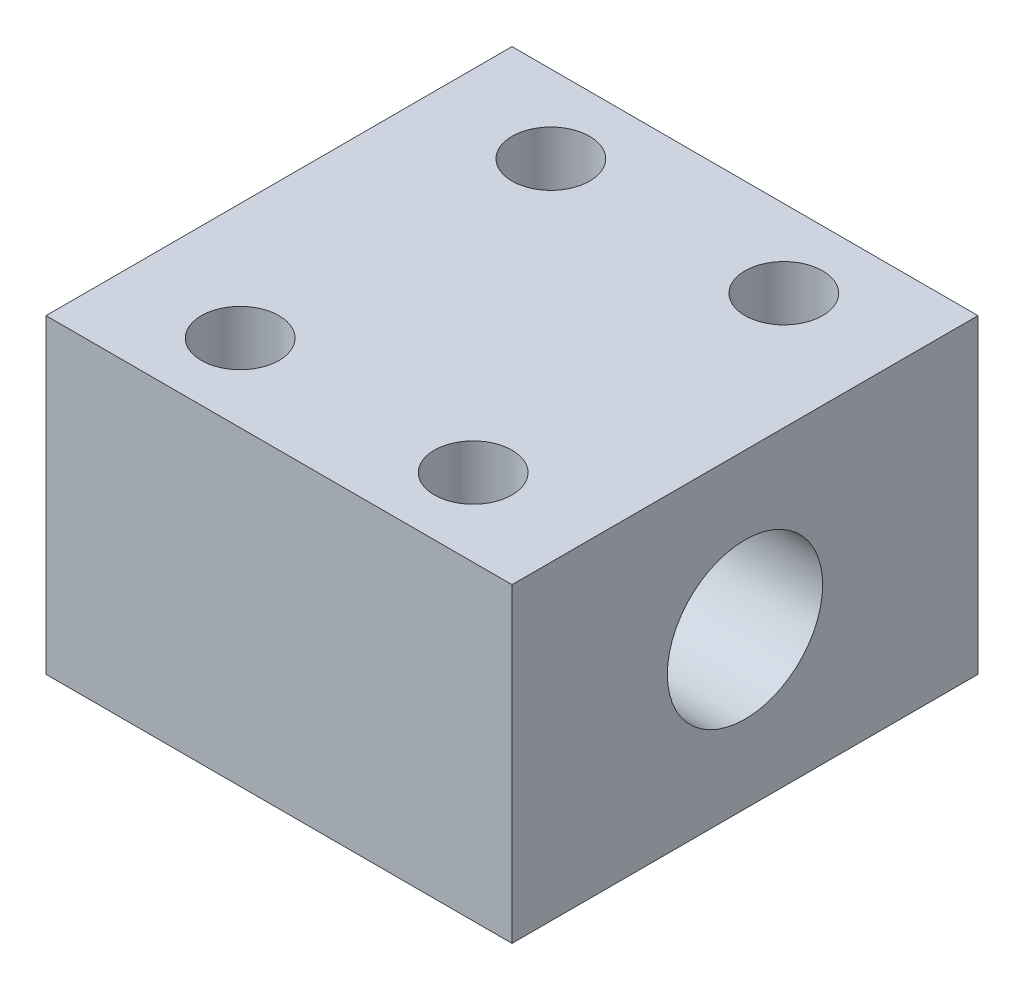
ISO-10303-21;
HEADER;
FILE_DESCRIPTION(('STEP AP214'),'2;1');
FILE_NAME('part.step','',(''),(''),'','','');
FILE_SCHEMA(('AUTOMOTIVE_DESIGN { 1 0 10303 214 1 1 1 1 }'));
ENDSEC;
DATA;
#1=APPLICATION_CONTEXT('core data for automotive mechanical design processes');
#2=APPLICATION_PROTOCOL_DEFINITION('international standard','automotive_design',2000,#1);
#3=PRODUCT_CONTEXT('',#1,'mechanical');
#4=PRODUCT('Part','Part','',(#3));
#5=PRODUCT_RELATED_PRODUCT_CATEGORY('part','',(#4));
#6=PRODUCT_DEFINITION_FORMATION('','',#4);
#7=PRODUCT_DEFINITION_CONTEXT('part definition',#1,'design');
#8=PRODUCT_DEFINITION('design','',#6,#7);
#9=PRODUCT_DEFINITION_SHAPE('','',#8);
#10=(LENGTH_UNIT() NAMED_UNIT(*) SI_UNIT(.MILLI.,.METRE.));
#11=(NAMED_UNIT(*) PLANE_ANGLE_UNIT() SI_UNIT($,.RADIAN.));
#12=(NAMED_UNIT(*) SI_UNIT($,.STERADIAN.) SOLID_ANGLE_UNIT());
#13=UNCERTAINTY_MEASURE_WITH_UNIT(LENGTH_MEASURE(1.E-05),#10,'distance_accuracy_value','');
#14=(GEOMETRIC_REPRESENTATION_CONTEXT(3) GLOBAL_UNCERTAINTY_ASSIGNED_CONTEXT((#13)) GLOBAL_UNIT_ASSIGNED_CONTEXT((#10,
#11,#12)) REPRESENTATION_CONTEXT('',''));
#15=CARTESIAN_POINT('',(0.,0.,0.));
#16=DIRECTION('',(0.,0.,1.));
#17=DIRECTION('',(1.,0.,0.));
#18=AXIS2_PLACEMENT_3D('',#15,#16,#17);
#19=CARTESIAN_POINT('',(0.,25.4,0.));
#20=DIRECTION('',(0.,1.,0.));
#21=DIRECTION('',(0.,0.,1.));
#22=AXIS2_PLACEMENT_3D('',#19,#20,#21);
#23=PLANE('',#22);
#24=CARTESIAN_POINT('',(9.525,25.4,12.7));
#25=DIRECTION('',(0.,1.,0.));
#26=DIRECTION('',(0.,0.,1.));
#27=AXIS2_PLACEMENT_3D('',#24,#25,#26);
#28=CIRCLE('',#27,3.175);
#29=CARTESIAN_POINT('',(9.525,25.4,15.875));
#30=VERTEX_POINT('',#29);
#31=EDGE_CURVE('E127',#30,#30,#28,.T.);
#32=ORIENTED_EDGE('',*,*,#31,.F.);
#33=EDGE_LOOP('',(#32));
#34=FACE_BOUND('',#33,.T.);
#35=CARTESIAN_POINT('',(-9.525,25.4,-12.7));
#36=DIRECTION('',(0.,1.,0.));
#37=DIRECTION('',(0.,0.,1.));
#38=AXIS2_PLACEMENT_3D('',#35,#36,#37);
#39=CIRCLE('',#38,3.175);
#40=CARTESIAN_POINT('',(-9.525,25.4,-9.525));
#41=VERTEX_POINT('',#40);
#42=EDGE_CURVE('E106',#41,#41,#39,.T.);
#43=ORIENTED_EDGE('',*,*,#42,.F.);
#44=EDGE_LOOP('',(#43));
#45=FACE_BOUND('',#44,.T.);
#46=DIRECTION('',(0.,0.,-1.));
#47=VECTOR('',#46,1.);
#48=CARTESIAN_POINT('',(19.05,25.4,-19.05));
#49=LINE('',#48,#47);
#50=CARTESIAN_POINT('',(19.05,25.4,19.05));
#51=VERTEX_POINT('',#50);
#52=CARTESIAN_POINT('',(19.05,25.4,-19.05));
#53=VERTEX_POINT('',#52);
#54=EDGE_CURVE('E91',#51,#53,#49,.T.);
#55=ORIENTED_EDGE('',*,*,#54,.T.);
#56=DIRECTION('',(-1.,0.,0.));
#57=VECTOR('',#56,1.);
#58=CARTESIAN_POINT('',(-19.05,25.4,-19.05));
#59=LINE('',#58,#57);
#60=CARTESIAN_POINT('',(-19.05,25.4,-19.05));
#61=VERTEX_POINT('',#60);
#62=EDGE_CURVE('E86',#53,#61,#59,.T.);
#63=ORIENTED_EDGE('',*,*,#62,.T.);
#64=DIRECTION('',(0.,0.,1.));
#65=VECTOR('',#64,1.);
#66=CARTESIAN_POINT('',(-19.05,25.4,-19.05));
#67=LINE('',#66,#65);
#68=CARTESIAN_POINT('',(-19.05,25.4,19.05));
#69=VERTEX_POINT('',#68);
#70=EDGE_CURVE('E89',#61,#69,#67,.T.);
#71=ORIENTED_EDGE('',*,*,#70,.T.);
#72=DIRECTION('',(1.,0.,0.));
#73=VECTOR('',#72,1.);
#74=CARTESIAN_POINT('',(-19.05,25.4,19.05));
#75=LINE('',#74,#73);
#76=EDGE_CURVE('E56',#69,#51,#75,.T.);
#77=ORIENTED_EDGE('',*,*,#76,.T.);
#78=EDGE_LOOP('',(#55,#63,#71,#77));
#79=FACE_BOUND('',#78,.T.);
#80=CARTESIAN_POINT('',(9.525,25.4,-12.7));
#81=DIRECTION('',(0.,1.,0.));
#82=DIRECTION('',(0.,0.,-1.));
#83=AXIS2_PLACEMENT_3D('',#80,#81,#82);
#84=CIRCLE('',#83,3.175);
#85=CARTESIAN_POINT('',(9.525,25.4,-15.875));
#86=VERTEX_POINT('',#85);
#87=EDGE_CURVE('E121',#86,#86,#84,.T.);
#88=ORIENTED_EDGE('',*,*,#87,.F.);
#89=EDGE_LOOP('',(#88));
#90=FACE_BOUND('',#89,.T.);
#91=CARTESIAN_POINT('',(-9.525,25.4,12.7));
#92=DIRECTION('',(0.,1.,0.));
#93=DIRECTION('',(0.,0.,-1.));
#94=AXIS2_PLACEMENT_3D('',#91,#92,#93);
#95=CIRCLE('',#94,3.175);
#96=CARTESIAN_POINT('',(-9.525,25.4,9.525));
#97=VERTEX_POINT('',#96);
#98=EDGE_CURVE('E133',#97,#97,#95,.T.);
#99=ORIENTED_EDGE('',*,*,#98,.F.);
#100=EDGE_LOOP('',(#99));
#101=FACE_BOUND('',#100,.T.);
#102=ADVANCED_FACE('F39',(#34,#45,#79,#90,#101),#23,.T.);
#103=CARTESIAN_POINT('',(0.,0.,0.));
#104=DIRECTION('',(0.,1.,0.));
#105=DIRECTION('',(0.,0.,1.));
#106=AXIS2_PLACEMENT_3D('',#103,#104,#105);
#107=PLANE('',#106);
#108=DIRECTION('',(0.,0.,-1.));
#109=VECTOR('',#108,1.);
#110=CARTESIAN_POINT('',(19.05,0.,-19.05));
#111=LINE('',#110,#109);
#112=CARTESIAN_POINT('',(19.05,0.,19.05));
#113=VERTEX_POINT('',#112);
#114=CARTESIAN_POINT('',(19.05,0.,-19.05));
#115=VERTEX_POINT('',#114);
#116=EDGE_CURVE('E103',#113,#115,#111,.T.);
#117=ORIENTED_EDGE('',*,*,#116,.F.);
#118=DIRECTION('',(1.,0.,0.));
#119=VECTOR('',#118,1.);
#120=CARTESIAN_POINT('',(-19.05,0.,19.05));
#121=LINE('',#120,#119);
#122=CARTESIAN_POINT('',(-19.05,0.,19.05));
#123=VERTEX_POINT('',#122);
#124=EDGE_CURVE('E79',#123,#113,#121,.T.);
#125=ORIENTED_EDGE('',*,*,#124,.F.);
#126=DIRECTION('',(0.,0.,1.));
#127=VECTOR('',#126,1.);
#128=CARTESIAN_POINT('',(-19.05,0.,-19.05));
#129=LINE('',#128,#127);
#130=CARTESIAN_POINT('',(-19.05,0.,-19.05));
#131=VERTEX_POINT('',#130);
#132=EDGE_CURVE('E73',#131,#123,#129,.T.);
#133=ORIENTED_EDGE('',*,*,#132,.F.);
#134=DIRECTION('',(-1.,0.,0.));
#135=VECTOR('',#134,1.);
#136=CARTESIAN_POINT('',(-19.05,0.,-19.05));
#137=LINE('',#136,#135);
#138=EDGE_CURVE('E95',#115,#131,#137,.T.);
#139=ORIENTED_EDGE('',*,*,#138,.F.);
#140=EDGE_LOOP('',(#117,#125,#133,#139));
#141=FACE_BOUND('',#140,.T.);
#142=CARTESIAN_POINT('',(-9.525,0.,-12.7));
#143=DIRECTION('',(0.,1.,0.));
#144=DIRECTION('',(0.,0.,1.));
#145=AXIS2_PLACEMENT_3D('',#142,#143,#144);
#146=CIRCLE('',#145,3.175);
#147=CARTESIAN_POINT('',(-9.525,0.,-9.525));
#148=VERTEX_POINT('',#147);
#149=EDGE_CURVE('E118',#148,#148,#146,.T.);
#150=ORIENTED_EDGE('',*,*,#149,.T.);
#151=EDGE_LOOP('',(#150));
#152=FACE_BOUND('',#151,.T.);
#153=CARTESIAN_POINT('',(9.525,0.,-12.7));
#154=DIRECTION('',(0.,1.,0.));
#155=DIRECTION('',(0.,0.,-1.));
#156=AXIS2_PLACEMENT_3D('',#153,#154,#155);
#157=CIRCLE('',#156,3.175);
#158=CARTESIAN_POINT('',(9.525,0.,-15.875));
#159=VERTEX_POINT('',#158);
#160=EDGE_CURVE('E124',#159,#159,#157,.T.);
#161=ORIENTED_EDGE('',*,*,#160,.T.);
#162=EDGE_LOOP('',(#161));
#163=FACE_BOUND('',#162,.T.);
#164=CARTESIAN_POINT('',(9.525,0.,12.7));
#165=DIRECTION('',(0.,1.,0.));
#166=DIRECTION('',(0.,0.,1.));
#167=AXIS2_PLACEMENT_3D('',#164,#165,#166);
#168=CIRCLE('',#167,3.175);
#169=CARTESIAN_POINT('',(9.525,0.,15.875));
#170=VERTEX_POINT('',#169);
#171=EDGE_CURVE('E130',#170,#170,#168,.T.);
#172=ORIENTED_EDGE('',*,*,#171,.T.);
#173=EDGE_LOOP('',(#172));
#174=FACE_BOUND('',#173,.T.);
#175=CARTESIAN_POINT('',(-9.525,0.,12.7));
#176=DIRECTION('',(0.,1.,0.));
#177=DIRECTION('',(0.,0.,-1.));
#178=AXIS2_PLACEMENT_3D('',#175,#176,#177);
#179=CIRCLE('',#178,3.175);
#180=CARTESIAN_POINT('',(-9.525,0.,9.525));
#181=VERTEX_POINT('',#180);
#182=EDGE_CURVE('E136',#181,#181,#179,.T.);
#183=ORIENTED_EDGE('',*,*,#182,.T.);
#184=EDGE_LOOP('',(#183));
#185=FACE_BOUND('',#184,.T.);
#186=ADVANCED_FACE('F114',(#141,#152,#163,#174,#185),#107,.F.);
#187=CARTESIAN_POINT('',(19.05,25.4,-19.05));
#188=DIRECTION('',(-1.,0.,0.));
#189=DIRECTION('',(0.,0.,1.));
#190=AXIS2_PLACEMENT_3D('',#187,#188,#189);
#191=PLANE('',#190);
#192=CARTESIAN_POINT('',(19.05,12.7,0.));
#193=DIRECTION('',(1.,0.,0.));
#194=DIRECTION('',(0.,0.,-1.));
#195=AXIS2_PLACEMENT_3D('',#192,#193,#194);
#196=CIRCLE('',#195,6.35);
#197=CARTESIAN_POINT('',(19.05,12.7,-6.35));
#198=VERTEX_POINT('',#197);
#199=EDGE_CURVE('E142',#198,#198,#196,.T.);
#200=ORIENTED_EDGE('',*,*,#199,.F.);
#201=EDGE_LOOP('',(#200));
#202=FACE_BOUND('',#201,.T.);
#203=ORIENTED_EDGE('',*,*,#116,.T.);
#204=DIRECTION('',(0.,-1.,0.));
#205=VECTOR('',#204,1.);
#206=CARTESIAN_POINT('',(19.05,25.4,-19.05));
#207=LINE('',#206,#205);
#208=EDGE_CURVE('E11',#53,#115,#207,.T.);
#209=ORIENTED_EDGE('',*,*,#208,.F.);
#210=ORIENTED_EDGE('',*,*,#54,.F.);
#211=DIRECTION('',(0.,-1.,0.));
#212=VECTOR('',#211,1.);
#213=CARTESIAN_POINT('',(19.05,25.4,19.05));
#214=LINE('',#213,#212);
#215=EDGE_CURVE('E99',#51,#113,#214,.T.);
#216=ORIENTED_EDGE('',*,*,#215,.T.);
#217=EDGE_LOOP('',(#203,#209,#210,#216));
#218=FACE_BOUND('',#217,.T.);
#219=ADVANCED_FACE('F41',(#202,#218),#191,.F.);
#220=CARTESIAN_POINT('',(-19.05,25.4,-19.05));
#221=DIRECTION('',(0.,0.,1.));
#222=DIRECTION('',(1.,0.,0.));
#223=AXIS2_PLACEMENT_3D('',#220,#221,#222);
#224=PLANE('',#223);
#225=ORIENTED_EDGE('',*,*,#138,.T.);
#226=DIRECTION('',(0.,-1.,0.));
#227=VECTOR('',#226,1.);
#228=CARTESIAN_POINT('',(-19.05,25.4,-19.05));
#229=LINE('',#228,#227);
#230=EDGE_CURVE('E48',#61,#131,#229,.T.);
#231=ORIENTED_EDGE('',*,*,#230,.F.);
#232=ORIENTED_EDGE('',*,*,#62,.F.);
#233=ORIENTED_EDGE('',*,*,#208,.T.);
#234=EDGE_LOOP('',(#225,#231,#232,#233));
#235=FACE_BOUND('',#234,.T.);
#236=ADVANCED_FACE('F94',(#235),#224,.F.);
#237=CARTESIAN_POINT('',(-19.05,25.4,-19.05));
#238=DIRECTION('',(1.,0.,0.));
#239=DIRECTION('',(0.,0.,-1.));
#240=AXIS2_PLACEMENT_3D('',#237,#238,#239);
#241=PLANE('',#240);
#242=CARTESIAN_POINT('',(-19.05,12.7,0.));
#243=DIRECTION('',(1.,0.,0.));
#244=DIRECTION('',(0.,0.,-1.));
#245=AXIS2_PLACEMENT_3D('',#242,#243,#244);
#246=CIRCLE('',#245,6.35);
#247=CARTESIAN_POINT('',(-19.05,12.7,-6.35));
#248=VERTEX_POINT('',#247);
#249=EDGE_CURVE('E139',#248,#248,#246,.T.);
#250=ORIENTED_EDGE('',*,*,#249,.T.);
#251=EDGE_LOOP('',(#250));
#252=FACE_BOUND('',#251,.T.);
#253=ORIENTED_EDGE('',*,*,#132,.T.);
#254=DIRECTION('',(0.,-1.,0.));
#255=VECTOR('',#254,1.);
#256=CARTESIAN_POINT('',(-19.05,25.4,19.05));
#257=LINE('',#256,#255);
#258=EDGE_CURVE('E96',#69,#123,#257,.T.);
#259=ORIENTED_EDGE('',*,*,#258,.F.);
#260=ORIENTED_EDGE('',*,*,#70,.F.);
#261=ORIENTED_EDGE('',*,*,#230,.T.);
#262=EDGE_LOOP('',(#253,#259,#260,#261));
#263=FACE_BOUND('',#262,.T.);
#264=ADVANCED_FACE('F97',(#252,#263),#241,.F.);
#265=CARTESIAN_POINT('',(-19.05,25.4,19.05));
#266=DIRECTION('',(0.,0.,-1.));
#267=DIRECTION('',(-1.,0.,0.));
#268=AXIS2_PLACEMENT_3D('',#265,#266,#267);
#269=PLANE('',#268);
#270=ORIENTED_EDGE('',*,*,#124,.T.);
#271=ORIENTED_EDGE('',*,*,#215,.F.);
#272=ORIENTED_EDGE('',*,*,#76,.F.);
#273=ORIENTED_EDGE('',*,*,#258,.T.);
#274=EDGE_LOOP('',(#270,#271,#272,#273));
#275=FACE_BOUND('',#274,.T.);
#276=ADVANCED_FACE('F111',(#275),#269,.F.);
#277=CARTESIAN_POINT('',(-9.525,25.4,-12.7));
#278=DIRECTION('',(0.,-1.,0.));
#279=DIRECTION('',(0.,0.,-1.));
#280=AXIS2_PLACEMENT_3D('',#277,#278,#279);
#281=CYLINDRICAL_SURFACE('',#280,3.175);
#282=ORIENTED_EDGE('',*,*,#42,.T.);
#283=EDGE_LOOP('',(#282));
#284=FACE_BOUND('',#283,.T.);
#285=ORIENTED_EDGE('',*,*,#149,.F.);
#286=EDGE_LOOP('',(#285));
#287=FACE_BOUND('',#286,.T.);
#288=ADVANCED_FACE('F172',(#284,#287),#281,.F.);
#289=CARTESIAN_POINT('',(9.525,25.4,-12.7));
#290=DIRECTION('',(0.,-1.,0.));
#291=DIRECTION('',(0.,0.,-1.));
#292=AXIS2_PLACEMENT_3D('',#289,#290,#291);
#293=CYLINDRICAL_SURFACE('',#292,3.175);
#294=ORIENTED_EDGE('',*,*,#87,.T.);
#295=EDGE_LOOP('',(#294));
#296=FACE_BOUND('',#295,.T.);
#297=ORIENTED_EDGE('',*,*,#160,.F.);
#298=EDGE_LOOP('',(#297));
#299=FACE_BOUND('',#298,.T.);
#300=ADVANCED_FACE('F205',(#296,#299),#293,.F.);
#301=CARTESIAN_POINT('',(9.525,25.4,12.7));
#302=DIRECTION('',(0.,-1.,0.));
#303=DIRECTION('',(0.,0.,-1.));
#304=AXIS2_PLACEMENT_3D('',#301,#302,#303);
#305=CYLINDRICAL_SURFACE('',#304,3.175);
#306=ORIENTED_EDGE('',*,*,#31,.T.);
#307=EDGE_LOOP('',(#306));
#308=FACE_BOUND('',#307,.T.);
#309=ORIENTED_EDGE('',*,*,#171,.F.);
#310=EDGE_LOOP('',(#309));
#311=FACE_BOUND('',#310,.T.);
#312=ADVANCED_FACE('F195',(#308,#311),#305,.F.);
#313=CARTESIAN_POINT('',(-9.525,25.4,12.7));
#314=DIRECTION('',(0.,-1.,0.));
#315=DIRECTION('',(0.,0.,-1.));
#316=AXIS2_PLACEMENT_3D('',#313,#314,#315);
#317=CYLINDRICAL_SURFACE('',#316,3.175);
#318=ORIENTED_EDGE('',*,*,#98,.T.);
#319=EDGE_LOOP('',(#318));
#320=FACE_BOUND('',#319,.T.);
#321=ORIENTED_EDGE('',*,*,#182,.F.);
#322=EDGE_LOOP('',(#321));
#323=FACE_BOUND('',#322,.T.);
#324=ADVANCED_FACE('F152',(#320,#323),#317,.F.);
#325=CARTESIAN_POINT('',(-19.05,12.7,0.));
#326=DIRECTION('',(1.,0.,0.));
#327=DIRECTION('',(0.,0.,-1.));
#328=AXIS2_PLACEMENT_3D('',#325,#326,#327);
#329=CYLINDRICAL_SURFACE('',#328,6.35);
#330=CARTESIAN_POINT('',(-19.05,12.7,-6.35));
#331=CARTESIAN_POINT('',(-18.653125,12.7,-6.35));
#332=CARTESIAN_POINT('',(-18.25625,12.7,-6.35));
#333=CARTESIAN_POINT('',(-17.4625,12.7,-6.35));
#334=CARTESIAN_POINT('',(-17.065625,12.7,-6.35));
#335=CARTESIAN_POINT('',(-16.271875,12.7,-6.35));
#336=CARTESIAN_POINT('',(-15.875,12.7,-6.35));
#337=CARTESIAN_POINT('',(-15.08125,12.7,-6.35));
#338=CARTESIAN_POINT('',(-14.684375,12.7,-6.35));
#339=CARTESIAN_POINT('',(-13.890625,12.7,-6.35));
#340=CARTESIAN_POINT('',(-13.49375,12.7,-6.35));
#341=CARTESIAN_POINT('',(-12.7,12.7,-6.35));
#342=CARTESIAN_POINT('',(-12.303125,12.7,-6.35));
#343=CARTESIAN_POINT('',(-11.509375,12.7,-6.35));
#344=CARTESIAN_POINT('',(-11.1125,12.7,-6.35));
#345=CARTESIAN_POINT('',(-10.31875,12.7,-6.35));
#346=CARTESIAN_POINT('',(-9.921875,12.7,-6.35));
#347=CARTESIAN_POINT('',(-9.128125,12.7,-6.35));
#348=CARTESIAN_POINT('',(-8.73125,12.7,-6.35));
#349=CARTESIAN_POINT('',(-7.9375,12.7,-6.35));
#350=CARTESIAN_POINT('',(-7.540625,12.7,-6.35));
#351=CARTESIAN_POINT('',(-6.746875,12.7,-6.35));
#352=CARTESIAN_POINT('',(-6.35,12.7,-6.35));
#353=CARTESIAN_POINT('',(-5.55625,12.7,-6.35));
#354=CARTESIAN_POINT('',(-5.159375,12.7,-6.35));
#355=CARTESIAN_POINT('',(-4.365625,12.7,-6.35));
#356=CARTESIAN_POINT('',(-3.96875,12.7,-6.35));
#357=CARTESIAN_POINT('',(-3.175,12.7,-6.35));
#358=CARTESIAN_POINT('',(-2.778125,12.7,-6.35));
#359=CARTESIAN_POINT('',(-1.984375,12.7,-6.35));
#360=CARTESIAN_POINT('',(-1.5875,12.7,-6.35));
#361=CARTESIAN_POINT('',(-0.79375,12.7,-6.35));
#362=CARTESIAN_POINT('',(-0.396875,12.7,-6.35));
#363=CARTESIAN_POINT('',(0.396875,12.7,-6.35));
#364=CARTESIAN_POINT('',(0.79375,12.7,-6.35));
#365=CARTESIAN_POINT('',(1.5875,12.7,-6.35));
#366=CARTESIAN_POINT('',(1.984375,12.7,-6.35));
#367=CARTESIAN_POINT('',(2.778125,12.7,-6.35));
#368=CARTESIAN_POINT('',(3.175,12.7,-6.35));
#369=CARTESIAN_POINT('',(3.96875,12.7,-6.35));
#370=CARTESIAN_POINT('',(4.365625,12.7,-6.35));
#371=CARTESIAN_POINT('',(5.159375,12.7,-6.35));
#372=CARTESIAN_POINT('',(5.55625,12.7,-6.35));
#373=CARTESIAN_POINT('',(6.35,12.7,-6.35));
#374=CARTESIAN_POINT('',(6.746875,12.7,-6.35));
#375=CARTESIAN_POINT('',(7.540625,12.7,-6.35));
#376=CARTESIAN_POINT('',(7.9375,12.7,-6.35));
#377=CARTESIAN_POINT('',(8.73125,12.7,-6.35));
#378=CARTESIAN_POINT('',(9.128125,12.7,-6.35));
#379=CARTESIAN_POINT('',(9.921875,12.7,-6.35));
#380=CARTESIAN_POINT('',(10.31875,12.7,-6.35));
#381=CARTESIAN_POINT('',(11.1125,12.7,-6.35));
#382=CARTESIAN_POINT('',(11.509375,12.7,-6.35));
#383=CARTESIAN_POINT('',(12.303125,12.7,-6.35));
#384=CARTESIAN_POINT('',(12.7,12.7,-6.35));
#385=CARTESIAN_POINT('',(13.49375,12.7,-6.35));
#386=CARTESIAN_POINT('',(13.890625,12.7,-6.35));
#387=CARTESIAN_POINT('',(14.684375,12.7,-6.35));
#388=CARTESIAN_POINT('',(15.08125,12.7,-6.35));
#389=CARTESIAN_POINT('',(15.875,12.7,-6.35));
#390=CARTESIAN_POINT('',(16.271875,12.7,-6.35));
#391=CARTESIAN_POINT('',(17.065625,12.7,-6.35));
#392=CARTESIAN_POINT('',(17.4625,12.7,-6.35));
#393=CARTESIAN_POINT('',(18.25625,12.7,-6.35));
#394=CARTESIAN_POINT('',(18.653125,12.7,-6.35));
#395=CARTESIAN_POINT('',(19.05,12.7,-6.35));
#396=B_SPLINE_CURVE_WITH_KNOTS('',3,(#330,#331,#332,#333,#334,#335,#336,#337,#338,#339,#340,
#341,#342,#343,#344,#345,#346,#347,#348,#349,#350,#351,#352,#353,#354,#355,#356,#357,#358,#359,
#360,#361,#362,#363,#364,#365,#366,#367,#368,#369,#370,#371,#372,#373,#374,#375,#376,#377,#378,
#379,#380,#381,#382,#383,#384,#385,#386,#387,#388,#389,#390,#391,#392,#393,#394,#395),
.UNSPECIFIED.,.F.,.F.,(4,2,2,2,2,2,2,2,2,2,2,2,2,2,2,2,2,2,2,2,2,2,2,2,2,2,2,2,2,2,2,2,4),(0.,
1.190625,2.38125,3.571875,4.7625,5.953125,7.14375,8.334375,9.525,10.715625,11.90625,13.096875,
14.2875,15.478125,16.66875,17.859375,19.05,20.240625,21.43125,22.621875,23.8125,25.003125,
26.19375,27.384375,28.575,29.765625,30.95625,32.146875,33.3375,34.528125,35.71875,36.909375,
38.1),.UNSPECIFIED.);
#397=EDGE_CURVE('BSEAM149',#248,#198,#396,.T.);
#398=ORIENTED_EDGE('',*,*,#249,.F.);
#399=ORIENTED_EDGE('',*,*,#199,.T.);
#400=ORIENTED_EDGE('',*,*,#397,.T.);
#401=ORIENTED_EDGE('',*,*,#397,.F.);
#402=EDGE_LOOP('',(#398,#400,#399,#401));
#403=FACE_BOUND('',#402,.T.);
#404=ADVANCED_FACE('F149',(#403),#329,.F.);
#405=CLOSED_SHELL('',(#102,#186,#219,#236,#264,#276,#288,#300,#312,#324,#404));
#406=MANIFOLD_SOLID_BREP('B2',#405);
#407=ADVANCED_BREP_SHAPE_REPRESENTATION('',(#18,#406),#14);
#408=SHAPE_DEFINITION_REPRESENTATION(#9,#407);
ENDSEC;
END-ISO-10303-21;
